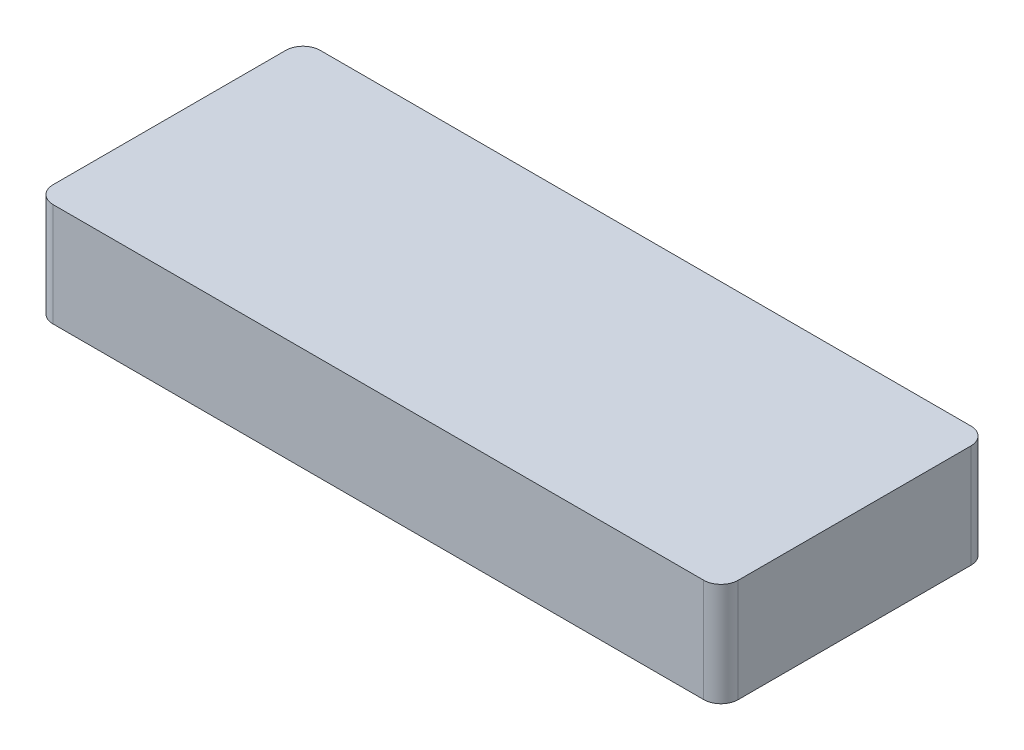
ISO-10303-21;
HEADER;
FILE_DESCRIPTION(('STEP AP214'),'2;1');
FILE_NAME('part.step','',(''),(''),'','','');
FILE_SCHEMA(('AUTOMOTIVE_DESIGN { 1 0 10303 214 1 1 1 1 }'));
ENDSEC;
DATA;
#1=APPLICATION_CONTEXT('core data for automotive mechanical design processes');
#2=APPLICATION_PROTOCOL_DEFINITION('international standard','automotive_design',2000,#1);
#3=PRODUCT_CONTEXT('',#1,'mechanical');
#4=PRODUCT('Part','Part','',(#3));
#5=PRODUCT_RELATED_PRODUCT_CATEGORY('part','',(#4));
#6=PRODUCT_DEFINITION_FORMATION('','',#4);
#7=PRODUCT_DEFINITION_CONTEXT('part definition',#1,'design');
#8=PRODUCT_DEFINITION('design','',#6,#7);
#9=PRODUCT_DEFINITION_SHAPE('','',#8);
#10=(LENGTH_UNIT() NAMED_UNIT(*) SI_UNIT(.MILLI.,.METRE.));
#11=(NAMED_UNIT(*) PLANE_ANGLE_UNIT() SI_UNIT($,.RADIAN.));
#12=(NAMED_UNIT(*) SI_UNIT($,.STERADIAN.) SOLID_ANGLE_UNIT());
#13=UNCERTAINTY_MEASURE_WITH_UNIT(LENGTH_MEASURE(1.E-05),#10,'distance_accuracy_value','');
#14=(GEOMETRIC_REPRESENTATION_CONTEXT(3) GLOBAL_UNCERTAINTY_ASSIGNED_CONTEXT((#13)) GLOBAL_UNIT_ASSIGNED_CONTEXT((#10,
#11,#12)) REPRESENTATION_CONTEXT('',''));
#15=CARTESIAN_POINT('',(0.,0.,0.));
#16=DIRECTION('',(0.,0.,1.));
#17=DIRECTION('',(1.,0.,0.));
#18=AXIS2_PLACEMENT_3D('',#15,#16,#17);
#19=CARTESIAN_POINT('',(-39.75,12.,15.5));
#20=DIRECTION('',(1.,0.,0.));
#21=DIRECTION('',(0.,0.,-1.));
#22=AXIS2_PLACEMENT_3D('',#19,#20,#21);
#23=PLANE('',#22);
#24=DIRECTION('',(0.,0.,1.));
#25=VECTOR('',#24,1.);
#26=CARTESIAN_POINT('',(-39.75,12.,15.5));
#27=LINE('',#26,#25);
#28=CARTESIAN_POINT('',(-39.75,12.,-13.5));
#29=VERTEX_POINT('',#28);
#30=CARTESIAN_POINT('',(-39.75,12.,13.5));
#31=VERTEX_POINT('',#30);
#32=EDGE_CURVE('E157',#29,#31,#27,.T.);
#33=ORIENTED_EDGE('',*,*,#32,.F.);
#34=DIRECTION('',(0.,-1.,0.));
#35=VECTOR('',#34,1.);
#36=CARTESIAN_POINT('',(-39.75,12.,-13.5));
#37=LINE('',#36,#35);
#38=CARTESIAN_POINT('',(-39.75,0.,-13.5));
#39=VERTEX_POINT('',#38);
#40=EDGE_CURVE('E142',#29,#39,#37,.T.);
#41=ORIENTED_EDGE('',*,*,#40,.T.);
#42=DIRECTION('',(0.,0.,1.));
#43=VECTOR('',#42,1.);
#44=CARTESIAN_POINT('',(-39.75,0.,15.5));
#45=LINE('',#44,#43);
#46=CARTESIAN_POINT('',(-39.75,0.,13.5));
#47=VERTEX_POINT('',#46);
#48=EDGE_CURVE('E154',#39,#47,#45,.T.);
#49=ORIENTED_EDGE('',*,*,#48,.T.);
#50=DIRECTION('',(0.,-1.,0.));
#51=VECTOR('',#50,1.);
#52=CARTESIAN_POINT('',(-39.75,12.,13.5));
#53=LINE('',#52,#51);
#54=EDGE_CURVE('E159',#47,#31,#53,.F.);
#55=ORIENTED_EDGE('',*,*,#54,.T.);
#56=EDGE_LOOP('',(#33,#41,#49,#55));
#57=FACE_BOUND('',#56,.T.);
#58=ADVANCED_FACE('F34',(#57),#23,.F.);
#59=CARTESIAN_POINT('',(39.75,12.,15.5));
#60=DIRECTION('',(0.,0.,-1.));
#61=DIRECTION('',(-1.,0.,0.));
#62=AXIS2_PLACEMENT_3D('',#59,#60,#61);
#63=PLANE('',#62);
#64=DIRECTION('',(1.,0.,0.));
#65=VECTOR('',#64,1.);
#66=CARTESIAN_POINT('',(39.75,0.,15.5));
#67=LINE('',#66,#65);
#68=CARTESIAN_POINT('',(-37.75,0.,15.5));
#69=VERTEX_POINT('',#68);
#70=CARTESIAN_POINT('',(37.75,0.,15.5));
#71=VERTEX_POINT('',#70);
#72=EDGE_CURVE('E163',#69,#71,#67,.T.);
#73=ORIENTED_EDGE('',*,*,#72,.T.);
#74=DIRECTION('',(0.,-1.,0.));
#75=VECTOR('',#74,1.);
#76=CARTESIAN_POINT('',(37.75,12.,15.5));
#77=LINE('',#76,#75);
#78=CARTESIAN_POINT('',(37.75,12.,15.5));
#79=VERTEX_POINT('',#78);
#80=EDGE_CURVE('E197',#71,#79,#77,.F.);
#81=ORIENTED_EDGE('',*,*,#80,.T.);
#82=DIRECTION('',(1.,0.,0.));
#83=VECTOR('',#82,1.);
#84=CARTESIAN_POINT('',(39.75,12.,15.5));
#85=LINE('',#84,#83);
#86=CARTESIAN_POINT('',(-37.75,12.,15.5));
#87=VERTEX_POINT('',#86);
#88=EDGE_CURVE('E381',#87,#79,#85,.T.);
#89=ORIENTED_EDGE('',*,*,#88,.F.);
#90=DIRECTION('',(0.,-1.,0.));
#91=VECTOR('',#90,1.);
#92=CARTESIAN_POINT('',(-37.75,12.,15.5));
#93=LINE('',#92,#91);
#94=EDGE_CURVE('E194',#87,#69,#93,.T.);
#95=ORIENTED_EDGE('',*,*,#94,.T.);
#96=EDGE_LOOP('',(#73,#81,#89,#95));
#97=FACE_BOUND('',#96,.T.);
#98=ADVANCED_FACE('F335',(#97),#63,.F.);
#99=CARTESIAN_POINT('',(39.75,12.,15.5));
#100=DIRECTION('',(-1.,0.,0.));
#101=DIRECTION('',(0.,0.,1.));
#102=AXIS2_PLACEMENT_3D('',#99,#100,#101);
#103=PLANE('',#102);
#104=DIRECTION('',(0.,0.,-1.));
#105=VECTOR('',#104,1.);
#106=CARTESIAN_POINT('',(39.75,0.,15.5));
#107=LINE('',#106,#105);
#108=CARTESIAN_POINT('',(39.75,0.,13.5));
#109=VERTEX_POINT('',#108);
#110=CARTESIAN_POINT('',(39.75,0.,-13.5));
#111=VERTEX_POINT('',#110);
#112=EDGE_CURVE('E166',#109,#111,#107,.T.);
#113=ORIENTED_EDGE('',*,*,#112,.T.);
#114=DIRECTION('',(0.,-1.,0.));
#115=VECTOR('',#114,1.);
#116=CARTESIAN_POINT('',(39.75,12.,-13.5));
#117=LINE('',#116,#115);
#118=CARTESIAN_POINT('',(39.75,12.,-13.5));
#119=VERTEX_POINT('',#118);
#120=EDGE_CURVE('E86',#111,#119,#117,.F.);
#121=ORIENTED_EDGE('',*,*,#120,.T.);
#122=DIRECTION('',(0.,0.,-1.));
#123=VECTOR('',#122,1.);
#124=CARTESIAN_POINT('',(39.75,12.,15.5));
#125=LINE('',#124,#123);
#126=CARTESIAN_POINT('',(39.75,12.,13.5));
#127=VERTEX_POINT('',#126);
#128=EDGE_CURVE('E376',#127,#119,#125,.T.);
#129=ORIENTED_EDGE('',*,*,#128,.F.);
#130=DIRECTION('',(0.,-1.,0.));
#131=VECTOR('',#130,1.);
#132=CARTESIAN_POINT('',(39.75,12.,13.5));
#133=LINE('',#132,#131);
#134=EDGE_CURVE('E190',#127,#109,#133,.T.);
#135=ORIENTED_EDGE('',*,*,#134,.T.);
#136=EDGE_LOOP('',(#113,#121,#129,#135));
#137=FACE_BOUND('',#136,.T.);
#138=ADVANCED_FACE('F327',(#137),#103,.F.);
#139=CARTESIAN_POINT('',(39.75,12.,-15.5));
#140=DIRECTION('',(0.,0.,1.));
#141=DIRECTION('',(1.,0.,0.));
#142=AXIS2_PLACEMENT_3D('',#139,#140,#141);
#143=PLANE('',#142);
#144=DIRECTION('',(-1.,0.,0.));
#145=VECTOR('',#144,1.);
#146=CARTESIAN_POINT('',(39.75,0.,-15.5));
#147=LINE('',#146,#145);
#148=CARTESIAN_POINT('',(37.75,0.,-15.5));
#149=VERTEX_POINT('',#148);
#150=CARTESIAN_POINT('',(-37.75,0.,-15.5));
#151=VERTEX_POINT('',#150);
#152=EDGE_CURVE('E173',#149,#151,#147,.T.);
#153=ORIENTED_EDGE('',*,*,#152,.T.);
#154=DIRECTION('',(0.,-1.,0.));
#155=VECTOR('',#154,1.);
#156=CARTESIAN_POINT('',(-37.75,12.,-15.5));
#157=LINE('',#156,#155);
#158=CARTESIAN_POINT('',(-37.75,12.,-15.5));
#159=VERTEX_POINT('',#158);
#160=EDGE_CURVE('E143',#151,#159,#157,.F.);
#161=ORIENTED_EDGE('',*,*,#160,.T.);
#162=DIRECTION('',(-1.,0.,0.));
#163=VECTOR('',#162,1.);
#164=CARTESIAN_POINT('',(39.75,12.,-15.5));
#165=LINE('',#164,#163);
#166=CARTESIAN_POINT('',(37.75,12.,-15.5));
#167=VERTEX_POINT('',#166);
#168=EDGE_CURVE('E169',#167,#159,#165,.T.);
#169=ORIENTED_EDGE('',*,*,#168,.F.);
#170=DIRECTION('',(0.,-1.,0.));
#171=VECTOR('',#170,1.);
#172=CARTESIAN_POINT('',(37.75,12.,-15.5));
#173=LINE('',#172,#171);
#174=EDGE_CURVE('E148',#167,#149,#173,.T.);
#175=ORIENTED_EDGE('',*,*,#174,.T.);
#176=EDGE_LOOP('',(#153,#161,#169,#175));
#177=FACE_BOUND('',#176,.T.);
#178=ADVANCED_FACE('F320',(#177),#143,.F.);
#179=CARTESIAN_POINT('',(0.,12.,0.));
#180=DIRECTION('',(0.,1.,0.));
#181=DIRECTION('',(0.,0.,1.));
#182=AXIS2_PLACEMENT_3D('',#179,#180,#181);
#183=PLANE('',#182);
#184=ORIENTED_EDGE('',*,*,#168,.T.);
#185=CARTESIAN_POINT('',(-37.75,12.,-13.5));
#186=DIRECTION('',(0.,1.,0.));
#187=DIRECTION('',(0.,0.,1.));
#188=AXIS2_PLACEMENT_3D('',#185,#186,#187);
#189=CIRCLE('',#188,2.);
#190=EDGE_CURVE('E188',#159,#29,#189,.T.);
#191=ORIENTED_EDGE('',*,*,#190,.T.);
#192=ORIENTED_EDGE('',*,*,#32,.T.);
#193=CARTESIAN_POINT('',(-37.75,12.,13.5));
#194=DIRECTION('',(0.,1.,0.));
#195=DIRECTION('',(0.,0.,1.));
#196=AXIS2_PLACEMENT_3D('',#193,#194,#195);
#197=CIRCLE('',#196,2.);
#198=EDGE_CURVE('E183',#31,#87,#197,.T.);
#199=ORIENTED_EDGE('',*,*,#198,.T.);
#200=ORIENTED_EDGE('',*,*,#88,.T.);
#201=CARTESIAN_POINT('',(37.75,12.,13.5));
#202=DIRECTION('',(0.,1.,0.));
#203=DIRECTION('',(0.,0.,1.));
#204=AXIS2_PLACEMENT_3D('',#201,#202,#203);
#205=CIRCLE('',#204,2.);
#206=EDGE_CURVE('E93',#79,#127,#205,.T.);
#207=ORIENTED_EDGE('',*,*,#206,.T.);
#208=ORIENTED_EDGE('',*,*,#128,.T.);
#209=CARTESIAN_POINT('',(37.75,12.,-13.5));
#210=DIRECTION('',(0.,1.,0.));
#211=DIRECTION('',(0.,0.,1.));
#212=AXIS2_PLACEMENT_3D('',#209,#210,#211);
#213=CIRCLE('',#212,2.);
#214=EDGE_CURVE('E186',#119,#167,#213,.T.);
#215=ORIENTED_EDGE('',*,*,#214,.T.);
#216=EDGE_LOOP('',(#184,#191,#192,#199,#200,#207,#208,#215));
#217=FACE_BOUND('',#216,.T.);
#218=ADVANCED_FACE('F313',(#217),#183,.T.);
#219=CARTESIAN_POINT('',(0.,0.,0.));
#220=DIRECTION('',(0.,1.,0.));
#221=DIRECTION('',(0.,0.,1.));
#222=AXIS2_PLACEMENT_3D('',#219,#220,#221);
#223=PLANE('',#222);
#224=ORIENTED_EDGE('',*,*,#48,.F.);
#225=CARTESIAN_POINT('',(-37.75,0.,-13.5));
#226=DIRECTION('',(0.,1.,0.));
#227=DIRECTION('',(0.,0.,1.));
#228=AXIS2_PLACEMENT_3D('',#225,#226,#227);
#229=CIRCLE('',#228,2.);
#230=EDGE_CURVE('E138',#39,#151,#229,.F.);
#231=ORIENTED_EDGE('',*,*,#230,.T.);
#232=ORIENTED_EDGE('',*,*,#152,.F.);
#233=CARTESIAN_POINT('',(37.75,0.,-13.5));
#234=DIRECTION('',(0.,1.,0.));
#235=DIRECTION('',(0.,0.,1.));
#236=AXIS2_PLACEMENT_3D('',#233,#234,#235);
#237=CIRCLE('',#236,2.);
#238=EDGE_CURVE('E149',#149,#111,#237,.F.);
#239=ORIENTED_EDGE('',*,*,#238,.T.);
#240=ORIENTED_EDGE('',*,*,#112,.F.);
#241=CARTESIAN_POINT('',(37.75,0.,13.5));
#242=DIRECTION('',(0.,1.,0.));
#243=DIRECTION('',(0.,0.,1.));
#244=AXIS2_PLACEMENT_3D('',#241,#242,#243);
#245=CIRCLE('',#244,2.);
#246=EDGE_CURVE('E177',#109,#71,#245,.F.);
#247=ORIENTED_EDGE('',*,*,#246,.T.);
#248=ORIENTED_EDGE('',*,*,#72,.F.);
#249=CARTESIAN_POINT('',(-37.75,0.,13.5));
#250=DIRECTION('',(0.,1.,0.));
#251=DIRECTION('',(0.,0.,1.));
#252=AXIS2_PLACEMENT_3D('',#249,#250,#251);
#253=CIRCLE('',#252,2.);
#254=EDGE_CURVE('E158',#69,#47,#253,.F.);
#255=ORIENTED_EDGE('',*,*,#254,.T.);
#256=EDGE_LOOP('',(#224,#231,#232,#239,#240,#247,#248,#255));
#257=FACE_BOUND('',#256,.T.);
#258=ADVANCED_FACE('F161',(#257),#223,.F.);
#259=CARTESIAN_POINT('',(-37.75,12.,-13.5));
#260=DIRECTION('',(0.,-1.,0.));
#261=DIRECTION('',(0.,0.,-1.));
#262=AXIS2_PLACEMENT_3D('',#259,#260,#261);
#263=CYLINDRICAL_SURFACE('',#262,2.);
#264=ORIENTED_EDGE('',*,*,#190,.F.);
#265=ORIENTED_EDGE('',*,*,#160,.F.);
#266=ORIENTED_EDGE('',*,*,#230,.F.);
#267=ORIENTED_EDGE('',*,*,#40,.F.);
#268=EDGE_LOOP('',(#264,#265,#266,#267));
#269=FACE_BOUND('',#268,.T.);
#270=ADVANCED_FACE('F141',(#269),#263,.T.);
#271=CARTESIAN_POINT('',(37.75,12.,-13.5));
#272=DIRECTION('',(0.,-1.,0.));
#273=DIRECTION('',(0.,0.,-1.));
#274=AXIS2_PLACEMENT_3D('',#271,#272,#273);
#275=CYLINDRICAL_SURFACE('',#274,2.);
#276=ORIENTED_EDGE('',*,*,#214,.F.);
#277=ORIENTED_EDGE('',*,*,#120,.F.);
#278=ORIENTED_EDGE('',*,*,#238,.F.);
#279=ORIENTED_EDGE('',*,*,#174,.F.);
#280=EDGE_LOOP('',(#276,#277,#278,#279));
#281=FACE_BOUND('',#280,.T.);
#282=ADVANCED_FACE('F293',(#281),#275,.T.);
#283=CARTESIAN_POINT('',(37.75,12.,13.5));
#284=DIRECTION('',(0.,-1.,0.));
#285=DIRECTION('',(0.,0.,-1.));
#286=AXIS2_PLACEMENT_3D('',#283,#284,#285);
#287=CYLINDRICAL_SURFACE('',#286,2.);
#288=ORIENTED_EDGE('',*,*,#206,.F.);
#289=ORIENTED_EDGE('',*,*,#80,.F.);
#290=ORIENTED_EDGE('',*,*,#246,.F.);
#291=ORIENTED_EDGE('',*,*,#134,.F.);
#292=EDGE_LOOP('',(#288,#289,#290,#291));
#293=FACE_BOUND('',#292,.T.);
#294=ADVANCED_FACE('F287',(#293),#287,.T.);
#295=CARTESIAN_POINT('',(-37.75,12.,13.5));
#296=DIRECTION('',(0.,-1.,0.));
#297=DIRECTION('',(0.,0.,-1.));
#298=AXIS2_PLACEMENT_3D('',#295,#296,#297);
#299=CYLINDRICAL_SURFACE('',#298,2.);
#300=ORIENTED_EDGE('',*,*,#198,.F.);
#301=ORIENTED_EDGE('',*,*,#54,.F.);
#302=ORIENTED_EDGE('',*,*,#254,.F.);
#303=ORIENTED_EDGE('',*,*,#94,.F.);
#304=EDGE_LOOP('',(#300,#301,#302,#303));
#305=FACE_BOUND('',#304,.T.);
#306=ADVANCED_FACE('F247',(#305),#299,.T.);
#307=CLOSED_SHELL('',(#58,#98,#138,#178,#218,#258,#270,#282,#294,#306));
#308=CARTESIAN_POINT('',(-37.75,12.,15.5));
#309=DIRECTION('',(1.,0.,0.));
#310=DIRECTION('',(0.,0.,-1.));
#311=AXIS2_PLACEMENT_3D('',#308,#309,#310);
#312=PLANE('',#311);
#313=DIRECTION('',(0.,0.,1.));
#314=VECTOR('',#313,1.);
#315=CARTESIAN_POINT('',(-37.75,10.,15.5));
#316=LINE('',#315,#314);
#317=CARTESIAN_POINT('',(-37.75,10.,-13.5));
#318=VERTEX_POINT('',#317);
#319=CARTESIAN_POINT('',(-37.75,10.,13.5));
#320=VERTEX_POINT('',#319);
#321=EDGE_CURVE('E78',#318,#320,#316,.T.);
#322=ORIENTED_EDGE('',*,*,#321,.T.);
#323=DIRECTION('',(0.,1.,0.));
#324=VECTOR('',#323,1.);
#325=CARTESIAN_POINT('',(-37.75,12.,13.5));
#326=LINE('',#325,#324);
#327=CARTESIAN_POINT('',(-37.75,2.,13.5));
#328=VERTEX_POINT('',#327);
#329=EDGE_CURVE('E215',#328,#320,#326,.T.);
#330=ORIENTED_EDGE('',*,*,#329,.F.);
#331=DIRECTION('',(0.,0.,1.));
#332=VECTOR('',#331,1.);
#333=CARTESIAN_POINT('',(-37.75,2.,15.5));
#334=LINE('',#333,#332);
#335=CARTESIAN_POINT('',(-37.75,2.,-13.5));
#336=VERTEX_POINT('',#335);
#337=EDGE_CURVE('E38',#336,#328,#334,.T.);
#338=ORIENTED_EDGE('',*,*,#337,.F.);
#339=DIRECTION('',(0.,1.,0.));
#340=VECTOR('',#339,1.);
#341=CARTESIAN_POINT('',(-37.75,12.,-13.5));
#342=LINE('',#341,#340);
#343=EDGE_CURVE('E203',#336,#318,#342,.T.);
#344=ORIENTED_EDGE('',*,*,#343,.T.);
#345=EDGE_LOOP('',(#322,#330,#338,#344));
#346=FACE_BOUND('',#345,.T.);
#347=ADVANCED_FACE('F222',(#346),#312,.T.);
#348=CARTESIAN_POINT('',(39.75,12.,13.5));
#349=DIRECTION('',(0.,0.,-1.));
#350=DIRECTION('',(-1.,0.,0.));
#351=AXIS2_PLACEMENT_3D('',#348,#349,#350);
#352=PLANE('',#351);
#353=DIRECTION('',(1.,0.,0.));
#354=VECTOR('',#353,1.);
#355=CARTESIAN_POINT('',(39.75,2.,13.5));
#356=LINE('',#355,#354);
#357=CARTESIAN_POINT('',(37.75,2.,13.5));
#358=VERTEX_POINT('',#357);
#359=EDGE_CURVE('E214',#328,#358,#356,.T.);
#360=ORIENTED_EDGE('',*,*,#359,.F.);
#361=ORIENTED_EDGE('',*,*,#329,.T.);
#362=DIRECTION('',(1.,0.,0.));
#363=VECTOR('',#362,1.);
#364=CARTESIAN_POINT('',(39.75,10.,13.5));
#365=LINE('',#364,#363);
#366=CARTESIAN_POINT('',(37.75,10.,13.5));
#367=VERTEX_POINT('',#366);
#368=EDGE_CURVE('E45',#320,#367,#365,.T.);
#369=ORIENTED_EDGE('',*,*,#368,.T.);
#370=DIRECTION('',(0.,1.,0.));
#371=VECTOR('',#370,1.);
#372=CARTESIAN_POINT('',(37.75,12.,13.5));
#373=LINE('',#372,#371);
#374=EDGE_CURVE('E211',#358,#367,#373,.T.);
#375=ORIENTED_EDGE('',*,*,#374,.F.);
#376=EDGE_LOOP('',(#360,#361,#369,#375));
#377=FACE_BOUND('',#376,.T.);
#378=ADVANCED_FACE('F219',(#377),#352,.T.);
#379=CARTESIAN_POINT('',(37.75,12.,15.5));
#380=DIRECTION('',(-1.,0.,0.));
#381=DIRECTION('',(0.,0.,1.));
#382=AXIS2_PLACEMENT_3D('',#379,#380,#381);
#383=PLANE('',#382);
#384=DIRECTION('',(0.,0.,-1.));
#385=VECTOR('',#384,1.);
#386=CARTESIAN_POINT('',(37.75,2.,15.5));
#387=LINE('',#386,#385);
#388=CARTESIAN_POINT('',(37.75,2.,-13.5));
#389=VERTEX_POINT('',#388);
#390=EDGE_CURVE('E209',#358,#389,#387,.T.);
#391=ORIENTED_EDGE('',*,*,#390,.F.);
#392=ORIENTED_EDGE('',*,*,#374,.T.);
#393=DIRECTION('',(0.,0.,-1.));
#394=VECTOR('',#393,1.);
#395=CARTESIAN_POINT('',(37.75,10.,15.5));
#396=LINE('',#395,#394);
#397=CARTESIAN_POINT('',(37.75,10.,-13.5));
#398=VERTEX_POINT('',#397);
#399=EDGE_CURVE('E11',#367,#398,#396,.T.);
#400=ORIENTED_EDGE('',*,*,#399,.T.);
#401=DIRECTION('',(0.,1.,0.));
#402=VECTOR('',#401,1.);
#403=CARTESIAN_POINT('',(37.75,12.,-13.5));
#404=LINE('',#403,#402);
#405=EDGE_CURVE('E207',#389,#398,#404,.T.);
#406=ORIENTED_EDGE('',*,*,#405,.F.);
#407=EDGE_LOOP('',(#391,#392,#400,#406));
#408=FACE_BOUND('',#407,.T.);
#409=ADVANCED_FACE('F230',(#408),#383,.T.);
#410=CARTESIAN_POINT('',(39.75,12.,-13.5));
#411=DIRECTION('',(0.,0.,1.));
#412=DIRECTION('',(1.,0.,0.));
#413=AXIS2_PLACEMENT_3D('',#410,#411,#412);
#414=PLANE('',#413);
#415=DIRECTION('',(-1.,0.,0.));
#416=VECTOR('',#415,1.);
#417=CARTESIAN_POINT('',(39.75,2.,-13.5));
#418=LINE('',#417,#416);
#419=EDGE_CURVE('E205',#389,#336,#418,.T.);
#420=ORIENTED_EDGE('',*,*,#419,.F.);
#421=ORIENTED_EDGE('',*,*,#405,.T.);
#422=DIRECTION('',(-1.,0.,0.));
#423=VECTOR('',#422,1.);
#424=CARTESIAN_POINT('',(39.75,10.,-13.5));
#425=LINE('',#424,#423);
#426=EDGE_CURVE('E54',#398,#318,#425,.T.);
#427=ORIENTED_EDGE('',*,*,#426,.T.);
#428=ORIENTED_EDGE('',*,*,#343,.F.);
#429=EDGE_LOOP('',(#420,#421,#427,#428));
#430=FACE_BOUND('',#429,.T.);
#431=ADVANCED_FACE('F226',(#430),#414,.T.);
#432=CARTESIAN_POINT('',(0.,10.,0.));
#433=DIRECTION('',(0.,1.,0.));
#434=DIRECTION('',(0.,0.,1.));
#435=AXIS2_PLACEMENT_3D('',#432,#433,#434);
#436=PLANE('',#435);
#437=ORIENTED_EDGE('',*,*,#426,.F.);
#438=ORIENTED_EDGE('',*,*,#399,.F.);
#439=ORIENTED_EDGE('',*,*,#368,.F.);
#440=ORIENTED_EDGE('',*,*,#321,.F.);
#441=EDGE_LOOP('',(#437,#438,#439,#440));
#442=FACE_BOUND('',#441,.T.);
#443=ADVANCED_FACE('F231',(#442),#436,.F.);
#444=CARTESIAN_POINT('',(0.,2.,0.));
#445=DIRECTION('',(0.,1.,0.));
#446=DIRECTION('',(0.,0.,1.));
#447=AXIS2_PLACEMENT_3D('',#444,#445,#446);
#448=PLANE('',#447);
#449=ORIENTED_EDGE('',*,*,#337,.T.);
#450=ORIENTED_EDGE('',*,*,#359,.T.);
#451=ORIENTED_EDGE('',*,*,#390,.T.);
#452=ORIENTED_EDGE('',*,*,#419,.T.);
#453=EDGE_LOOP('',(#449,#450,#451,#452));
#454=FACE_BOUND('',#453,.T.);
#455=ADVANCED_FACE('F36',(#454),#448,.T.);
#456=CLOSED_SHELL('',(#347,#378,#409,#431,#443,#455));
#457=ORIENTED_CLOSED_SHELL('',*,#456,.T.);
#458=BREP_WITH_VOIDS('B2',#307,(#457));
#459=ADVANCED_BREP_SHAPE_REPRESENTATION('',(#18,#458),#14);
#460=SHAPE_DEFINITION_REPRESENTATION(#9,#459);
ENDSEC;
END-ISO-10303-21;
